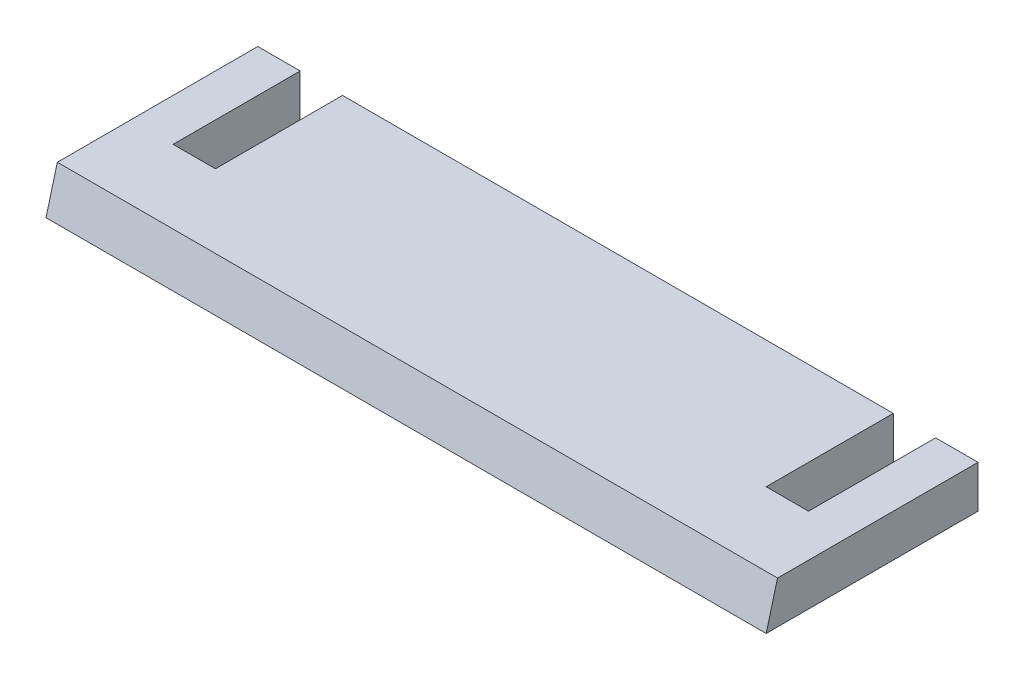
ISO-10303-21;
HEADER;
FILE_DESCRIPTION(('STEP AP214'),'2;1');
FILE_NAME('part.step','',(''),(''),'','','');
FILE_SCHEMA(('AUTOMOTIVE_DESIGN { 1 0 10303 214 1 1 1 1 }'));
ENDSEC;
DATA;
#1=APPLICATION_CONTEXT('core data for automotive mechanical design processes');
#2=APPLICATION_PROTOCOL_DEFINITION('international standard','automotive_design',2000,#1);
#3=PRODUCT_CONTEXT('',#1,'mechanical');
#4=PRODUCT('Part','Part','',(#3));
#5=PRODUCT_RELATED_PRODUCT_CATEGORY('part','',(#4));
#6=PRODUCT_DEFINITION_FORMATION('','',#4);
#7=PRODUCT_DEFINITION_CONTEXT('part definition',#1,'design');
#8=PRODUCT_DEFINITION('design','',#6,#7);
#9=PRODUCT_DEFINITION_SHAPE('','',#8);
#10=(LENGTH_UNIT() NAMED_UNIT(*) SI_UNIT(.MILLI.,.METRE.));
#11=(NAMED_UNIT(*) PLANE_ANGLE_UNIT() SI_UNIT($,.RADIAN.));
#12=(NAMED_UNIT(*) SI_UNIT($,.STERADIAN.) SOLID_ANGLE_UNIT());
#13=UNCERTAINTY_MEASURE_WITH_UNIT(LENGTH_MEASURE(1.E-05),#10,'distance_accuracy_value','');
#14=(GEOMETRIC_REPRESENTATION_CONTEXT(3) GLOBAL_UNCERTAINTY_ASSIGNED_CONTEXT((#13)) GLOBAL_UNIT_ASSIGNED_CONTEXT((#10,
#11,#12)) REPRESENTATION_CONTEXT('',''));
#15=CARTESIAN_POINT('',(0.,0.,0.));
#16=DIRECTION('',(0.,0.,1.));
#17=DIRECTION('',(1.,0.,0.));
#18=AXIS2_PLACEMENT_3D('',#15,#16,#17);
#19=CARTESIAN_POINT('',(-75.,10.,-25.));
#20=DIRECTION('',(0.,0.,1.));
#21=DIRECTION('',(1.,0.,0.));
#22=AXIS2_PLACEMENT_3D('',#19,#20,#21);
#23=PLANE('',#22);
#24=DIRECTION('',(-1.,0.,0.));
#25=VECTOR('',#24,1.);
#26=CARTESIAN_POINT('',(-75.,0.,-25.));
#27=LINE('',#26,#25);
#28=CARTESIAN_POINT('',(-75.,0.,-25.));
#29=VERTEX_POINT('',#28);
#30=CARTESIAN_POINT('',(-85.,0.,-25.));
#31=VERTEX_POINT('',#30);
#32=EDGE_CURVE('E151',#29,#31,#27,.T.);
#33=ORIENTED_EDGE('',*,*,#32,.T.);
#34=DIRECTION('',(0.,-1.,0.));
#35=VECTOR('',#34,1.);
#36=CARTESIAN_POINT('',(-85.,10.,-25.));
#37=LINE('',#36,#35);
#38=CARTESIAN_POINT('',(-85.,10.,-25.));
#39=VERTEX_POINT('',#38);
#40=EDGE_CURVE('E11',#39,#31,#37,.T.);
#41=ORIENTED_EDGE('',*,*,#40,.F.);
#42=DIRECTION('',(-1.,0.,0.));
#43=VECTOR('',#42,1.);
#44=CARTESIAN_POINT('',(-75.,10.,-25.));
#45=LINE('',#44,#43);
#46=CARTESIAN_POINT('',(-75.,10.,-25.));
#47=VERTEX_POINT('',#46);
#48=EDGE_CURVE('E175',#47,#39,#45,.T.);
#49=ORIENTED_EDGE('',*,*,#48,.F.);
#50=DIRECTION('',(0.,-1.,0.));
#51=VECTOR('',#50,1.);
#52=CARTESIAN_POINT('',(-75.,10.,-25.));
#53=LINE('',#52,#51);
#54=EDGE_CURVE('E147',#47,#29,#53,.T.);
#55=ORIENTED_EDGE('',*,*,#54,.T.);
#56=EDGE_LOOP('',(#33,#41,#49,#55));
#57=FACE_BOUND('',#56,.T.);
#58=ADVANCED_FACE('F33',(#57),#23,.F.);
#59=CARTESIAN_POINT('',(-85.,10.,25.));
#60=DIRECTION('',(1.,0.,0.));
#61=DIRECTION('',(0.,0.,-1.));
#62=AXIS2_PLACEMENT_3D('',#59,#60,#61);
#63=PLANE('',#62);
#64=DIRECTION('',(0.,0.,1.));
#65=VECTOR('',#64,1.);
#66=CARTESIAN_POINT('',(-85.,0.,25.));
#67=LINE('',#66,#65);
#68=CARTESIAN_POINT('',(-85.,0.,25.));
#69=VERTEX_POINT('',#68);
#70=EDGE_CURVE('E154',#31,#69,#67,.T.);
#71=ORIENTED_EDGE('',*,*,#70,.T.);
#72=DIRECTION('',(0.,0.965925826289068,-0.258819045102521));
#73=VECTOR('',#72,1.);
#74=CARTESIAN_POINT('',(-85.,0.,25.));
#75=LINE('',#74,#73);
#76=CARTESIAN_POINT('',(-85.,10.,22.3205080756888));
#77=VERTEX_POINT('',#76);
#78=EDGE_CURVE('E43',#77,#69,#75,.F.);
#79=ORIENTED_EDGE('',*,*,#78,.F.);
#80=DIRECTION('',(0.,0.,1.));
#81=VECTOR('',#80,1.);
#82=CARTESIAN_POINT('',(-85.,10.,25.));
#83=LINE('',#82,#81);
#84=EDGE_CURVE('E98',#39,#77,#83,.T.);
#85=ORIENTED_EDGE('',*,*,#84,.F.);
#86=ORIENTED_EDGE('',*,*,#40,.T.);
#87=EDGE_LOOP('',(#71,#79,#85,#86));
#88=FACE_BOUND('',#87,.T.);
#89=ADVANCED_FACE('F230',(#88),#63,.F.);
#90=CARTESIAN_POINT('',(85.,0.,25.));
#91=DIRECTION('',(0.,0.258819045102521,0.965925826289068));
#92=DIRECTION('',(0.,-0.965925826289068,0.258819045102521));
#93=AXIS2_PLACEMENT_3D('',#90,#91,#92);
#94=PLANE('',#93);
#95=DIRECTION('',(1.,0.,0.));
#96=VECTOR('',#95,1.);
#97=CARTESIAN_POINT('',(85.,0.,25.));
#98=LINE('',#97,#96);
#99=CARTESIAN_POINT('',(85.,0.,25.));
#100=VERTEX_POINT('',#99);
#101=EDGE_CURVE('E156',#69,#100,#98,.T.);
#102=ORIENTED_EDGE('',*,*,#101,.T.);
#103=DIRECTION('',(0.,0.965925826289068,-0.258819045102521));
#104=VECTOR('',#103,1.);
#105=CARTESIAN_POINT('',(85.,9.33012701892219,22.5));
#106=LINE('',#105,#104);
#107=CARTESIAN_POINT('',(85.,10.,22.3205080756888));
#108=VERTEX_POINT('',#107);
#109=EDGE_CURVE('E37',#108,#100,#106,.F.);
#110=ORIENTED_EDGE('',*,*,#109,.F.);
#111=DIRECTION('',(-1.,0.,0.));
#112=VECTOR('',#111,1.);
#113=CARTESIAN_POINT('',(0.,10.,22.3205080756888));
#114=LINE('',#113,#112);
#115=EDGE_CURVE('E196',#77,#108,#114,.F.);
#116=ORIENTED_EDGE('',*,*,#115,.F.);
#117=ORIENTED_EDGE('',*,*,#78,.T.);
#118=EDGE_LOOP('',(#102,#110,#116,#117));
#119=FACE_BOUND('',#118,.T.);
#120=ADVANCED_FACE('F35',(#119),#94,.T.);
#121=CARTESIAN_POINT('',(85.,10.,25.));
#122=DIRECTION('',(-1.,0.,0.));
#123=DIRECTION('',(0.,0.,1.));
#124=AXIS2_PLACEMENT_3D('',#121,#122,#123);
#125=PLANE('',#124);
#126=DIRECTION('',(0.,0.,-1.));
#127=VECTOR('',#126,1.);
#128=CARTESIAN_POINT('',(85.,0.,25.));
#129=LINE('',#128,#127);
#130=CARTESIAN_POINT('',(85.,0.,-25.));
#131=VERTEX_POINT('',#130);
#132=EDGE_CURVE('E158',#100,#131,#129,.T.);
#133=ORIENTED_EDGE('',*,*,#132,.T.);
#134=DIRECTION('',(0.,-1.,0.));
#135=VECTOR('',#134,1.);
#136=CARTESIAN_POINT('',(85.,10.,-25.));
#137=LINE('',#136,#135);
#138=CARTESIAN_POINT('',(85.,10.,-25.));
#139=VERTEX_POINT('',#138);
#140=EDGE_CURVE('E192',#139,#131,#137,.T.);
#141=ORIENTED_EDGE('',*,*,#140,.F.);
#142=DIRECTION('',(0.,0.,-1.));
#143=VECTOR('',#142,1.);
#144=CARTESIAN_POINT('',(85.,10.,25.));
#145=LINE('',#144,#143);
#146=EDGE_CURVE('E197',#108,#139,#145,.T.);
#147=ORIENTED_EDGE('',*,*,#146,.F.);
#148=ORIENTED_EDGE('',*,*,#109,.T.);
#149=EDGE_LOOP('',(#133,#141,#147,#148));
#150=FACE_BOUND('',#149,.T.);
#151=ADVANCED_FACE('F239',(#150),#125,.F.);
#152=CARTESIAN_POINT('',(85.,10.,-25.));
#153=DIRECTION('',(0.,0.,1.));
#154=DIRECTION('',(1.,0.,0.));
#155=AXIS2_PLACEMENT_3D('',#152,#153,#154);
#156=PLANE('',#155);
#157=DIRECTION('',(-1.,0.,0.));
#158=VECTOR('',#157,1.);
#159=CARTESIAN_POINT('',(85.,0.,-25.));
#160=LINE('',#159,#158);
#161=CARTESIAN_POINT('',(75.,0.,-25.0000000000001));
#162=VERTEX_POINT('',#161);
#163=EDGE_CURVE('E160',#131,#162,#160,.T.);
#164=ORIENTED_EDGE('',*,*,#163,.T.);
#165=DIRECTION('',(0.,-1.,0.));
#166=VECTOR('',#165,1.);
#167=CARTESIAN_POINT('',(75.,10.,-25.0000000000001));
#168=LINE('',#167,#166);
#169=CARTESIAN_POINT('',(75.,10.,-25.0000000000001));
#170=VERTEX_POINT('',#169);
#171=EDGE_CURVE('E189',#170,#162,#168,.T.);
#172=ORIENTED_EDGE('',*,*,#171,.F.);
#173=DIRECTION('',(-1.,0.,0.));
#174=VECTOR('',#173,1.);
#175=CARTESIAN_POINT('',(85.,10.,-25.));
#176=LINE('',#175,#174);
#177=EDGE_CURVE('E200',#139,#170,#176,.T.);
#178=ORIENTED_EDGE('',*,*,#177,.F.);
#179=ORIENTED_EDGE('',*,*,#140,.T.);
#180=EDGE_LOOP('',(#164,#172,#178,#179));
#181=FACE_BOUND('',#180,.T.);
#182=ADVANCED_FACE('F243',(#181),#156,.F.);
#183=CARTESIAN_POINT('',(75.,10.,-25.0000000000001));
#184=DIRECTION('',(1.,0.,0.));
#185=DIRECTION('',(0.,0.,-1.));
#186=AXIS2_PLACEMENT_3D('',#183,#184,#185);
#187=PLANE('',#186);
#188=DIRECTION('',(0.,0.,1.));
#189=VECTOR('',#188,1.);
#190=CARTESIAN_POINT('',(75.,0.,-25.0000000000001));
#191=LINE('',#190,#189);
#192=CARTESIAN_POINT('',(75.,0.,4.99999999999992));
#193=VERTEX_POINT('',#192);
#194=EDGE_CURVE('E162',#162,#193,#191,.T.);
#195=ORIENTED_EDGE('',*,*,#194,.T.);
#196=DIRECTION('',(0.,-1.,0.));
#197=VECTOR('',#196,1.);
#198=CARTESIAN_POINT('',(75.,10.,4.99999999999992));
#199=LINE('',#198,#197);
#200=CARTESIAN_POINT('',(75.,10.,4.99999999999992));
#201=VERTEX_POINT('',#200);
#202=EDGE_CURVE('E186',#201,#193,#199,.T.);
#203=ORIENTED_EDGE('',*,*,#202,.F.);
#204=DIRECTION('',(0.,0.,1.));
#205=VECTOR('',#204,1.);
#206=CARTESIAN_POINT('',(75.,10.,-25.0000000000001));
#207=LINE('',#206,#205);
#208=EDGE_CURVE('E206',#170,#201,#207,.T.);
#209=ORIENTED_EDGE('',*,*,#208,.F.);
#210=ORIENTED_EDGE('',*,*,#171,.T.);
#211=EDGE_LOOP('',(#195,#203,#209,#210));
#212=FACE_BOUND('',#211,.T.);
#213=ADVANCED_FACE('F248',(#212),#187,.F.);
#214=CARTESIAN_POINT('',(75.,10.,4.99999999999992));
#215=DIRECTION('',(0.,0.,1.));
#216=DIRECTION('',(1.,0.,0.));
#217=AXIS2_PLACEMENT_3D('',#214,#215,#216);
#218=PLANE('',#217);
#219=DIRECTION('',(-1.,0.,0.));
#220=VECTOR('',#219,1.);
#221=CARTESIAN_POINT('',(75.,0.,4.99999999999992));
#222=LINE('',#221,#220);
#223=CARTESIAN_POINT('',(65.,0.,4.99999999999994));
#224=VERTEX_POINT('',#223);
#225=EDGE_CURVE('E164',#193,#224,#222,.T.);
#226=ORIENTED_EDGE('',*,*,#225,.T.);
#227=DIRECTION('',(0.,-1.,0.));
#228=VECTOR('',#227,1.);
#229=CARTESIAN_POINT('',(65.,10.,4.99999999999994));
#230=LINE('',#229,#228);
#231=CARTESIAN_POINT('',(65.,10.,4.99999999999994));
#232=VERTEX_POINT('',#231);
#233=EDGE_CURVE('E183',#232,#224,#230,.T.);
#234=ORIENTED_EDGE('',*,*,#233,.F.);
#235=DIRECTION('',(-1.,0.,0.));
#236=VECTOR('',#235,1.);
#237=CARTESIAN_POINT('',(75.,10.,4.99999999999992));
#238=LINE('',#237,#236);
#239=EDGE_CURVE('E208',#201,#232,#238,.T.);
#240=ORIENTED_EDGE('',*,*,#239,.F.);
#241=ORIENTED_EDGE('',*,*,#202,.T.);
#242=EDGE_LOOP('',(#226,#234,#240,#241));
#243=FACE_BOUND('',#242,.T.);
#244=ADVANCED_FACE('F251',(#243),#218,.F.);
#245=CARTESIAN_POINT('',(65.,10.,-25.0000000000001));
#246=DIRECTION('',(-1.,0.,0.));
#247=DIRECTION('',(0.,0.,1.));
#248=AXIS2_PLACEMENT_3D('',#245,#246,#247);
#249=PLANE('',#248);
#250=DIRECTION('',(0.,0.,-1.));
#251=VECTOR('',#250,1.);
#252=CARTESIAN_POINT('',(65.,0.,-25.0000000000001));
#253=LINE('',#252,#251);
#254=CARTESIAN_POINT('',(65.,0.,-25.0000000000001));
#255=VERTEX_POINT('',#254);
#256=EDGE_CURVE('E166',#224,#255,#253,.T.);
#257=ORIENTED_EDGE('',*,*,#256,.T.);
#258=DIRECTION('',(0.,-1.,0.));
#259=VECTOR('',#258,1.);
#260=CARTESIAN_POINT('',(65.,10.,-25.0000000000001));
#261=LINE('',#260,#259);
#262=CARTESIAN_POINT('',(65.,10.,-25.0000000000001));
#263=VERTEX_POINT('',#262);
#264=EDGE_CURVE('E180',#263,#255,#261,.T.);
#265=ORIENTED_EDGE('',*,*,#264,.F.);
#266=DIRECTION('',(0.,0.,-1.));
#267=VECTOR('',#266,1.);
#268=CARTESIAN_POINT('',(65.,10.,-25.0000000000001));
#269=LINE('',#268,#267);
#270=EDGE_CURVE('E210',#232,#263,#269,.T.);
#271=ORIENTED_EDGE('',*,*,#270,.F.);
#272=ORIENTED_EDGE('',*,*,#233,.T.);
#273=EDGE_LOOP('',(#257,#265,#271,#272));
#274=FACE_BOUND('',#273,.T.);
#275=ADVANCED_FACE('F216',(#274),#249,.F.);
#276=CARTESIAN_POINT('',(65.,10.,-25.0000000000001));
#277=DIRECTION('',(0.,0.,1.));
#278=DIRECTION('',(1.,0.,0.));
#279=AXIS2_PLACEMENT_3D('',#276,#277,#278);
#280=PLANE('',#279);
#281=DIRECTION('',(-1.,0.,0.));
#282=VECTOR('',#281,1.);
#283=CARTESIAN_POINT('',(65.,0.,-25.0000000000001));
#284=LINE('',#283,#282);
#285=CARTESIAN_POINT('',(-65.,0.,-25.));
#286=VERTEX_POINT('',#285);
#287=EDGE_CURVE('E168',#255,#286,#284,.T.);
#288=ORIENTED_EDGE('',*,*,#287,.T.);
#289=DIRECTION('',(0.,-1.,0.));
#290=VECTOR('',#289,1.);
#291=CARTESIAN_POINT('',(-65.,10.,-25.));
#292=LINE('',#291,#290);
#293=CARTESIAN_POINT('',(-65.,10.,-25.));
#294=VERTEX_POINT('',#293);
#295=EDGE_CURVE('E141',#294,#286,#292,.T.);
#296=ORIENTED_EDGE('',*,*,#295,.F.);
#297=DIRECTION('',(-1.,0.,0.));
#298=VECTOR('',#297,1.);
#299=CARTESIAN_POINT('',(65.,10.,-25.0000000000001));
#300=LINE('',#299,#298);
#301=EDGE_CURVE('E129',#263,#294,#300,.T.);
#302=ORIENTED_EDGE('',*,*,#301,.F.);
#303=ORIENTED_EDGE('',*,*,#264,.T.);
#304=EDGE_LOOP('',(#288,#296,#302,#303));
#305=FACE_BOUND('',#304,.T.);
#306=ADVANCED_FACE('F220',(#305),#280,.F.);
#307=CARTESIAN_POINT('',(-65.,10.,-25.));
#308=DIRECTION('',(1.,0.,0.));
#309=DIRECTION('',(0.,0.,-1.));
#310=AXIS2_PLACEMENT_3D('',#307,#308,#309);
#311=PLANE('',#310);
#312=DIRECTION('',(0.,0.,1.));
#313=VECTOR('',#312,1.);
#314=CARTESIAN_POINT('',(-65.,0.,-25.));
#315=LINE('',#314,#313);
#316=CARTESIAN_POINT('',(-65.,0.,5.00000000000001));
#317=VERTEX_POINT('',#316);
#318=EDGE_CURVE('E138',#286,#317,#315,.T.);
#319=ORIENTED_EDGE('',*,*,#318,.T.);
#320=DIRECTION('',(0.,-1.,0.));
#321=VECTOR('',#320,1.);
#322=CARTESIAN_POINT('',(-65.,10.,5.00000000000001));
#323=LINE('',#322,#321);
#324=CARTESIAN_POINT('',(-65.,10.,5.00000000000001));
#325=VERTEX_POINT('',#324);
#326=EDGE_CURVE('E135',#325,#317,#323,.T.);
#327=ORIENTED_EDGE('',*,*,#326,.F.);
#328=DIRECTION('',(0.,0.,1.));
#329=VECTOR('',#328,1.);
#330=CARTESIAN_POINT('',(-65.,10.,-25.));
#331=LINE('',#330,#329);
#332=EDGE_CURVE('E122',#294,#325,#331,.T.);
#333=ORIENTED_EDGE('',*,*,#332,.F.);
#334=ORIENTED_EDGE('',*,*,#295,.T.);
#335=EDGE_LOOP('',(#319,#327,#333,#334));
#336=FACE_BOUND('',#335,.T.);
#337=ADVANCED_FACE('F136',(#336),#311,.F.);
#338=CARTESIAN_POINT('',(-75.,10.,5.00000000000001));
#339=DIRECTION('',(0.,0.,1.));
#340=DIRECTION('',(1.,0.,0.));
#341=AXIS2_PLACEMENT_3D('',#338,#339,#340);
#342=PLANE('',#341);
#343=DIRECTION('',(-1.,0.,0.));
#344=VECTOR('',#343,1.);
#345=CARTESIAN_POINT('',(-75.,0.,5.00000000000001));
#346=LINE('',#345,#344);
#347=CARTESIAN_POINT('',(-75.,0.,5.00000000000001));
#348=VERTEX_POINT('',#347);
#349=EDGE_CURVE('E171',#317,#348,#346,.T.);
#350=ORIENTED_EDGE('',*,*,#349,.T.);
#351=DIRECTION('',(0.,-1.,0.));
#352=VECTOR('',#351,1.);
#353=CARTESIAN_POINT('',(-75.,10.,5.00000000000001));
#354=LINE('',#353,#352);
#355=CARTESIAN_POINT('',(-75.,10.,5.00000000000001));
#356=VERTEX_POINT('',#355);
#357=EDGE_CURVE('E142',#356,#348,#354,.T.);
#358=ORIENTED_EDGE('',*,*,#357,.F.);
#359=DIRECTION('',(-1.,0.,0.));
#360=VECTOR('',#359,1.);
#361=CARTESIAN_POINT('',(-75.,10.,5.00000000000001));
#362=LINE('',#361,#360);
#363=EDGE_CURVE('E126',#325,#356,#362,.T.);
#364=ORIENTED_EDGE('',*,*,#363,.F.);
#365=ORIENTED_EDGE('',*,*,#326,.T.);
#366=EDGE_LOOP('',(#350,#358,#364,#365));
#367=FACE_BOUND('',#366,.T.);
#368=ADVANCED_FACE('F144',(#367),#342,.F.);
#369=CARTESIAN_POINT('',(-75.,10.,-25.));
#370=DIRECTION('',(-1.,0.,0.));
#371=DIRECTION('',(0.,0.,1.));
#372=AXIS2_PLACEMENT_3D('',#369,#370,#371);
#373=PLANE('',#372);
#374=DIRECTION('',(0.,0.,-1.));
#375=VECTOR('',#374,1.);
#376=CARTESIAN_POINT('',(-75.,0.,-25.));
#377=LINE('',#376,#375);
#378=EDGE_CURVE('E173',#348,#29,#377,.T.);
#379=ORIENTED_EDGE('',*,*,#378,.T.);
#380=ORIENTED_EDGE('',*,*,#54,.F.);
#381=DIRECTION('',(0.,0.,-1.));
#382=VECTOR('',#381,1.);
#383=CARTESIAN_POINT('',(-75.,10.,-25.));
#384=LINE('',#383,#382);
#385=EDGE_CURVE('E52',#356,#47,#384,.T.);
#386=ORIENTED_EDGE('',*,*,#385,.F.);
#387=ORIENTED_EDGE('',*,*,#357,.T.);
#388=EDGE_LOOP('',(#379,#380,#386,#387));
#389=FACE_BOUND('',#388,.T.);
#390=ADVANCED_FACE('F226',(#389),#373,.F.);
#391=CARTESIAN_POINT('',(0.,10.,0.));
#392=DIRECTION('',(0.,-1.,0.));
#393=DIRECTION('',(0.,0.,-1.));
#394=AXIS2_PLACEMENT_3D('',#391,#392,#393);
#395=PLANE('',#394);
#396=ORIENTED_EDGE('',*,*,#48,.T.);
#397=ORIENTED_EDGE('',*,*,#84,.T.);
#398=ORIENTED_EDGE('',*,*,#115,.T.);
#399=ORIENTED_EDGE('',*,*,#146,.T.);
#400=ORIENTED_EDGE('',*,*,#177,.T.);
#401=ORIENTED_EDGE('',*,*,#208,.T.);
#402=ORIENTED_EDGE('',*,*,#239,.T.);
#403=ORIENTED_EDGE('',*,*,#270,.T.);
#404=ORIENTED_EDGE('',*,*,#301,.T.);
#405=ORIENTED_EDGE('',*,*,#332,.T.);
#406=ORIENTED_EDGE('',*,*,#363,.T.);
#407=ORIENTED_EDGE('',*,*,#385,.T.);
#408=EDGE_LOOP('',(#396,#397,#398,#399,#400,#401,#402,#403,#404,#405,#406,#407));
#409=FACE_BOUND('',#408,.T.);
#410=ADVANCED_FACE('F124',(#409),#395,.F.);
#411=CARTESIAN_POINT('',(0.,0.,0.));
#412=DIRECTION('',(0.,-1.,0.));
#413=DIRECTION('',(0.,0.,-1.));
#414=AXIS2_PLACEMENT_3D('',#411,#412,#413);
#415=PLANE('',#414);
#416=ORIENTED_EDGE('',*,*,#32,.F.);
#417=ORIENTED_EDGE('',*,*,#378,.F.);
#418=ORIENTED_EDGE('',*,*,#349,.F.);
#419=ORIENTED_EDGE('',*,*,#318,.F.);
#420=ORIENTED_EDGE('',*,*,#287,.F.);
#421=ORIENTED_EDGE('',*,*,#256,.F.);
#422=ORIENTED_EDGE('',*,*,#225,.F.);
#423=ORIENTED_EDGE('',*,*,#194,.F.);
#424=ORIENTED_EDGE('',*,*,#163,.F.);
#425=ORIENTED_EDGE('',*,*,#132,.F.);
#426=ORIENTED_EDGE('',*,*,#101,.F.);
#427=ORIENTED_EDGE('',*,*,#70,.F.);
#428=EDGE_LOOP('',(#416,#417,#418,#419,#420,#421,#422,#423,#424,#425,#426,#427));
#429=FACE_BOUND('',#428,.T.);
#430=ADVANCED_FACE('F223',(#429),#415,.T.);
#431=CLOSED_SHELL('',(#58,#89,#120,#151,#182,#213,#244,#275,#306,#337,#368,#390,#410,#430));
#432=MANIFOLD_SOLID_BREP('B2',#431);
#433=ADVANCED_BREP_SHAPE_REPRESENTATION('',(#18,#432),#14);
#434=SHAPE_DEFINITION_REPRESENTATION(#9,#433);
ENDSEC;
END-ISO-10303-21;
